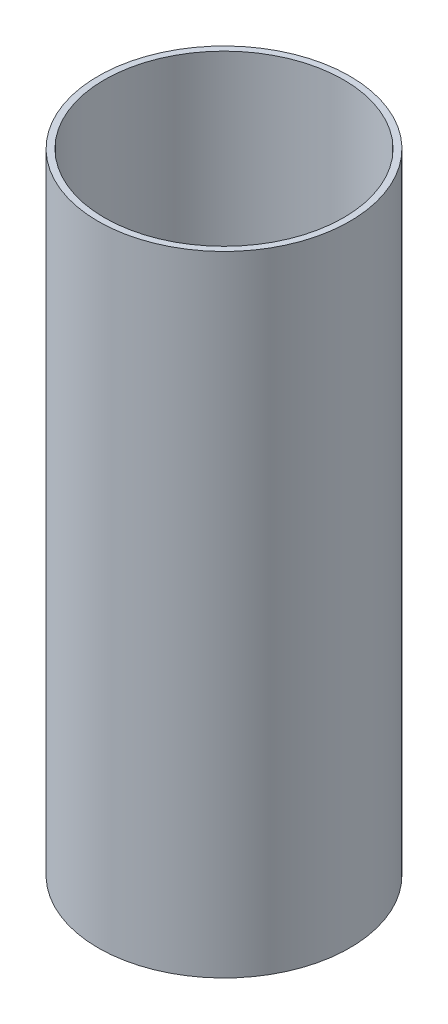
ISO-10303-21;
HEADER;
FILE_DESCRIPTION(('STEP AP214'),'2;1');
FILE_NAME('part.step','',(''),(''),'','','');
FILE_SCHEMA(('AUTOMOTIVE_DESIGN { 1 0 10303 214 1 1 1 1 }'));
ENDSEC;
DATA;
#1=APPLICATION_CONTEXT('core data for automotive mechanical design processes');
#2=APPLICATION_PROTOCOL_DEFINITION('international standard','automotive_design',2000,#1);
#3=PRODUCT_CONTEXT('',#1,'mechanical');
#4=PRODUCT('Part','Part','',(#3));
#5=PRODUCT_RELATED_PRODUCT_CATEGORY('part','',(#4));
#6=PRODUCT_DEFINITION_FORMATION('','',#4);
#7=PRODUCT_DEFINITION_CONTEXT('part definition',#1,'design');
#8=PRODUCT_DEFINITION('design','',#6,#7);
#9=PRODUCT_DEFINITION_SHAPE('','',#8);
#10=(LENGTH_UNIT() NAMED_UNIT(*) SI_UNIT(.MILLI.,.METRE.));
#11=(NAMED_UNIT(*) PLANE_ANGLE_UNIT() SI_UNIT($,.RADIAN.));
#12=(NAMED_UNIT(*) SI_UNIT($,.STERADIAN.) SOLID_ANGLE_UNIT());
#13=UNCERTAINTY_MEASURE_WITH_UNIT(LENGTH_MEASURE(1.E-05),#10,'distance_accuracy_value','');
#14=(GEOMETRIC_REPRESENTATION_CONTEXT(3) GLOBAL_UNCERTAINTY_ASSIGNED_CONTEXT((#13)) GLOBAL_UNIT_ASSIGNED_CONTEXT((#10,
#11,#12)) REPRESENTATION_CONTEXT('',''));
#15=CARTESIAN_POINT('',(0.,0.,0.));
#16=DIRECTION('',(0.,0.,1.));
#17=DIRECTION('',(1.,0.,0.));
#18=AXIS2_PLACEMENT_3D('',#15,#16,#17);
#19=CARTESIAN_POINT('',(0.,200.,0.));
#20=DIRECTION('',(0.,1.,0.));
#21=DIRECTION('',(0.,0.,1.));
#22=AXIS2_PLACEMENT_3D('',#19,#20,#21);
#23=PLANE('',#22);
#24=CARTESIAN_POINT('',(0.,200.,0.));
#25=DIRECTION('',(0.,1.,0.));
#26=DIRECTION('',(0.,0.,1.));
#27=AXIS2_PLACEMENT_3D('',#24,#25,#26);
#28=CIRCLE('',#27,40.);
#29=CARTESIAN_POINT('',(0.,200.,40.));
#30=VERTEX_POINT('',#29);
#31=EDGE_CURVE('E10',#30,#30,#28,.T.);
#32=ORIENTED_EDGE('',*,*,#31,.T.);
#33=EDGE_LOOP('',(#32));
#34=FACE_BOUND('',#33,.T.);
#35=CARTESIAN_POINT('',(0.,200.,0.));
#36=DIRECTION('',(0.,1.,0.));
#37=DIRECTION('',(0.,0.,1.));
#38=AXIS2_PLACEMENT_3D('',#35,#36,#37);
#39=CIRCLE('',#38,38.);
#40=CARTESIAN_POINT('',(0.,200.,38.));
#41=VERTEX_POINT('',#40);
#42=EDGE_CURVE('E42',#41,#41,#39,.T.);
#43=ORIENTED_EDGE('',*,*,#42,.F.);
#44=EDGE_LOOP('',(#43));
#45=FACE_BOUND('',#44,.T.);
#46=ADVANCED_FACE('F31',(#34,#45),#23,.T.);
#47=CARTESIAN_POINT('',(0.,0.,0.));
#48=DIRECTION('',(0.,1.,0.));
#49=DIRECTION('',(0.,0.,1.));
#50=AXIS2_PLACEMENT_3D('',#47,#48,#49);
#51=PLANE('',#50);
#52=CARTESIAN_POINT('',(0.,0.,0.));
#53=DIRECTION('',(0.,1.,0.));
#54=DIRECTION('',(0.,0.,1.));
#55=AXIS2_PLACEMENT_3D('',#52,#53,#54);
#56=CIRCLE('',#55,40.);
#57=CARTESIAN_POINT('',(0.,0.,40.));
#58=VERTEX_POINT('',#57);
#59=EDGE_CURVE('E35',#58,#58,#56,.T.);
#60=ORIENTED_EDGE('',*,*,#59,.F.);
#61=EDGE_LOOP('',(#60));
#62=FACE_BOUND('',#61,.T.);
#63=CARTESIAN_POINT('',(0.,0.,0.));
#64=DIRECTION('',(0.,1.,0.));
#65=DIRECTION('',(0.,0.,1.));
#66=AXIS2_PLACEMENT_3D('',#63,#64,#65);
#67=CIRCLE('',#66,38.);
#68=CARTESIAN_POINT('',(0.,0.,38.));
#69=VERTEX_POINT('',#68);
#70=EDGE_CURVE('E44',#69,#69,#67,.T.);
#71=ORIENTED_EDGE('',*,*,#70,.T.);
#72=EDGE_LOOP('',(#71));
#73=FACE_BOUND('',#72,.T.);
#74=ADVANCED_FACE('F54',(#62,#73),#51,.F.);
#75=CARTESIAN_POINT('',(0.,200.,0.));
#76=DIRECTION('',(0.,-1.,0.));
#77=DIRECTION('',(0.,0.,-1.));
#78=AXIS2_PLACEMENT_3D('',#75,#76,#77);
#79=CYLINDRICAL_SURFACE('',#78,40.);
#80=ORIENTED_EDGE('',*,*,#31,.F.);
#81=EDGE_LOOP('',(#80));
#82=FACE_BOUND('',#81,.T.);
#83=ORIENTED_EDGE('',*,*,#59,.T.);
#84=EDGE_LOOP('',(#83));
#85=FACE_BOUND('',#84,.T.);
#86=ADVANCED_FACE('F33',(#82,#85),#79,.T.);
#87=CARTESIAN_POINT('',(0.,200.,0.));
#88=DIRECTION('',(0.,-1.,0.));
#89=DIRECTION('',(0.,0.,-1.));
#90=AXIS2_PLACEMENT_3D('',#87,#88,#89);
#91=CYLINDRICAL_SURFACE('',#90,38.);
#92=ORIENTED_EDGE('',*,*,#42,.T.);
#93=EDGE_LOOP('',(#92));
#94=FACE_BOUND('',#93,.T.);
#95=ORIENTED_EDGE('',*,*,#70,.F.);
#96=EDGE_LOOP('',(#95));
#97=FACE_BOUND('',#96,.T.);
#98=ADVANCED_FACE('F50',(#94,#97),#91,.F.);
#99=CLOSED_SHELL('',(#46,#74,#86,#98));
#100=MANIFOLD_SOLID_BREP('B2',#99);
#101=ADVANCED_BREP_SHAPE_REPRESENTATION('',(#18,#100),#14);
#102=SHAPE_DEFINITION_REPRESENTATION(#9,#101);
ENDSEC;
END-ISO-10303-21;
